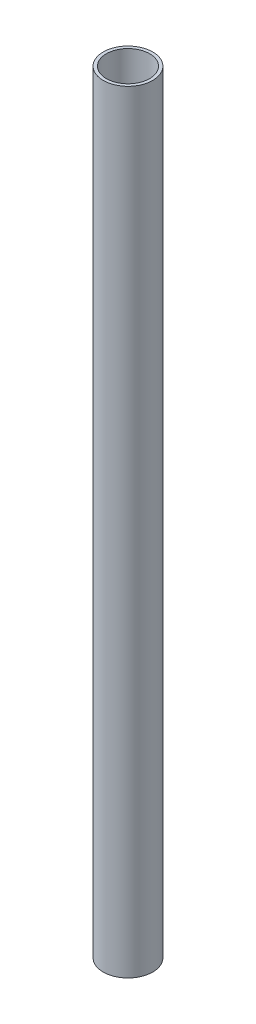
ISO-10303-21;
HEADER;
FILE_DESCRIPTION(('STEP AP214'),'2;1');
FILE_NAME('part.step','',(''),(''),'','','');
FILE_SCHEMA(('AUTOMOTIVE_DESIGN { 1 0 10303 214 1 1 1 1 }'));
ENDSEC;
DATA;
#1=APPLICATION_CONTEXT('core data for automotive mechanical design processes');
#2=APPLICATION_PROTOCOL_DEFINITION('international standard','automotive_design',2000,#1);
#3=PRODUCT_CONTEXT('',#1,'mechanical');
#4=PRODUCT('Part','Part','',(#3));
#5=PRODUCT_RELATED_PRODUCT_CATEGORY('part','',(#4));
#6=PRODUCT_DEFINITION_FORMATION('','',#4);
#7=PRODUCT_DEFINITION_CONTEXT('part definition',#1,'design');
#8=PRODUCT_DEFINITION('design','',#6,#7);
#9=PRODUCT_DEFINITION_SHAPE('','',#8);
#10=(LENGTH_UNIT() NAMED_UNIT(*) SI_UNIT(.MILLI.,.METRE.));
#11=(NAMED_UNIT(*) PLANE_ANGLE_UNIT() SI_UNIT($,.RADIAN.));
#12=(NAMED_UNIT(*) SI_UNIT($,.STERADIAN.) SOLID_ANGLE_UNIT());
#13=UNCERTAINTY_MEASURE_WITH_UNIT(LENGTH_MEASURE(1.E-05),#10,'distance_accuracy_value','');
#14=(GEOMETRIC_REPRESENTATION_CONTEXT(3) GLOBAL_UNCERTAINTY_ASSIGNED_CONTEXT((#13)) GLOBAL_UNIT_ASSIGNED_CONTEXT((#10,
#11,#12)) REPRESENTATION_CONTEXT('',''));
#15=CARTESIAN_POINT('',(0.,0.,0.));
#16=DIRECTION('',(0.,0.,1.));
#17=DIRECTION('',(1.,0.,0.));
#18=AXIS2_PLACEMENT_3D('',#15,#16,#17);
#19=CARTESIAN_POINT('',(0.,250.,0.));
#20=DIRECTION('',(0.,1.,0.));
#21=DIRECTION('',(0.,0.,1.));
#22=AXIS2_PLACEMENT_3D('',#19,#20,#21);
#23=PLANE('',#22);
#24=CARTESIAN_POINT('',(0.,250.,0.));
#25=DIRECTION('',(0.,1.,0.));
#26=DIRECTION('',(0.,0.,1.));
#27=AXIS2_PLACEMENT_3D('',#24,#25,#26);
#28=CIRCLE('',#27,8.);
#29=CARTESIAN_POINT('',(0.,250.,8.));
#30=VERTEX_POINT('',#29);
#31=EDGE_CURVE('E10',#30,#30,#28,.T.);
#32=ORIENTED_EDGE('',*,*,#31,.T.);
#33=EDGE_LOOP('',(#32));
#34=FACE_BOUND('',#33,.T.);
#35=CARTESIAN_POINT('',(0.,250.,0.));
#36=DIRECTION('',(0.,1.,0.));
#37=DIRECTION('',(0.,0.,1.));
#38=AXIS2_PLACEMENT_3D('',#35,#36,#37);
#39=CIRCLE('',#38,7.);
#40=CARTESIAN_POINT('',(0.,250.,7.));
#41=VERTEX_POINT('',#40);
#42=EDGE_CURVE('E58',#41,#41,#39,.T.);
#43=ORIENTED_EDGE('',*,*,#42,.F.);
#44=EDGE_LOOP('',(#43));
#45=FACE_BOUND('',#44,.T.);
#46=ADVANCED_FACE('F45',(#34,#45),#23,.T.);
#47=CARTESIAN_POINT('',(0.,0.,0.));
#48=DIRECTION('',(0.,1.,0.));
#49=DIRECTION('',(0.,0.,1.));
#50=AXIS2_PLACEMENT_3D('',#47,#48,#49);
#51=PLANE('',#50);
#52=CARTESIAN_POINT('',(0.,0.,0.));
#53=DIRECTION('',(0.,1.,0.));
#54=DIRECTION('',(0.,0.,1.));
#55=AXIS2_PLACEMENT_3D('',#52,#53,#54);
#56=CIRCLE('',#55,8.);
#57=CARTESIAN_POINT('',(0.,0.,8.));
#58=VERTEX_POINT('',#57);
#59=EDGE_CURVE('E49',#58,#58,#56,.T.);
#60=ORIENTED_EDGE('',*,*,#59,.F.);
#61=EDGE_LOOP('',(#60));
#62=FACE_BOUND('',#61,.T.);
#63=CARTESIAN_POINT('',(0.,0.,0.));
#64=DIRECTION('',(0.,1.,0.));
#65=DIRECTION('',(0.,0.,1.));
#66=AXIS2_PLACEMENT_3D('',#63,#64,#65);
#67=CIRCLE('',#66,7.);
#68=CARTESIAN_POINT('',(0.,0.,7.));
#69=VERTEX_POINT('',#68);
#70=EDGE_CURVE('E60',#69,#69,#67,.T.);
#71=ORIENTED_EDGE('',*,*,#70,.T.);
#72=EDGE_LOOP('',(#71));
#73=FACE_BOUND('',#72,.T.);
#74=ADVANCED_FACE('F72',(#62,#73),#51,.F.);
#75=CARTESIAN_POINT('',(0.,250.,0.));
#76=DIRECTION('',(0.,-1.,0.));
#77=DIRECTION('',(0.,0.,-1.));
#78=AXIS2_PLACEMENT_3D('',#75,#76,#77);
#79=CYLINDRICAL_SURFACE('',#78,8.);
#80=ORIENTED_EDGE('',*,*,#31,.F.);
#81=EDGE_LOOP('',(#80));
#82=FACE_BOUND('',#81,.T.);
#83=ORIENTED_EDGE('',*,*,#59,.T.);
#84=EDGE_LOOP('',(#83));
#85=FACE_BOUND('',#84,.T.);
#86=ADVANCED_FACE('F47',(#82,#85),#79,.T.);
#87=CARTESIAN_POINT('',(0.,250.,0.));
#88=DIRECTION('',(0.,-1.,0.));
#89=DIRECTION('',(0.,0.,-1.));
#90=AXIS2_PLACEMENT_3D('',#87,#88,#89);
#91=CYLINDRICAL_SURFACE('',#90,7.);
#92=ORIENTED_EDGE('',*,*,#42,.T.);
#93=EDGE_LOOP('',(#92));
#94=FACE_BOUND('',#93,.T.);
#95=ORIENTED_EDGE('',*,*,#70,.F.);
#96=EDGE_LOOP('',(#95));
#97=FACE_BOUND('',#96,.T.);
#98=ADVANCED_FACE('F68',(#94,#97),#91,.F.);
#99=CLOSED_SHELL('',(#46,#74,#86,#98));
#100=MANIFOLD_SOLID_BREP('B2',#99);
#101=ADVANCED_BREP_SHAPE_REPRESENTATION('',(#18,#100),#14);
#102=SHAPE_DEFINITION_REPRESENTATION(#9,#101);
ENDSEC;
END-ISO-10303-21;
